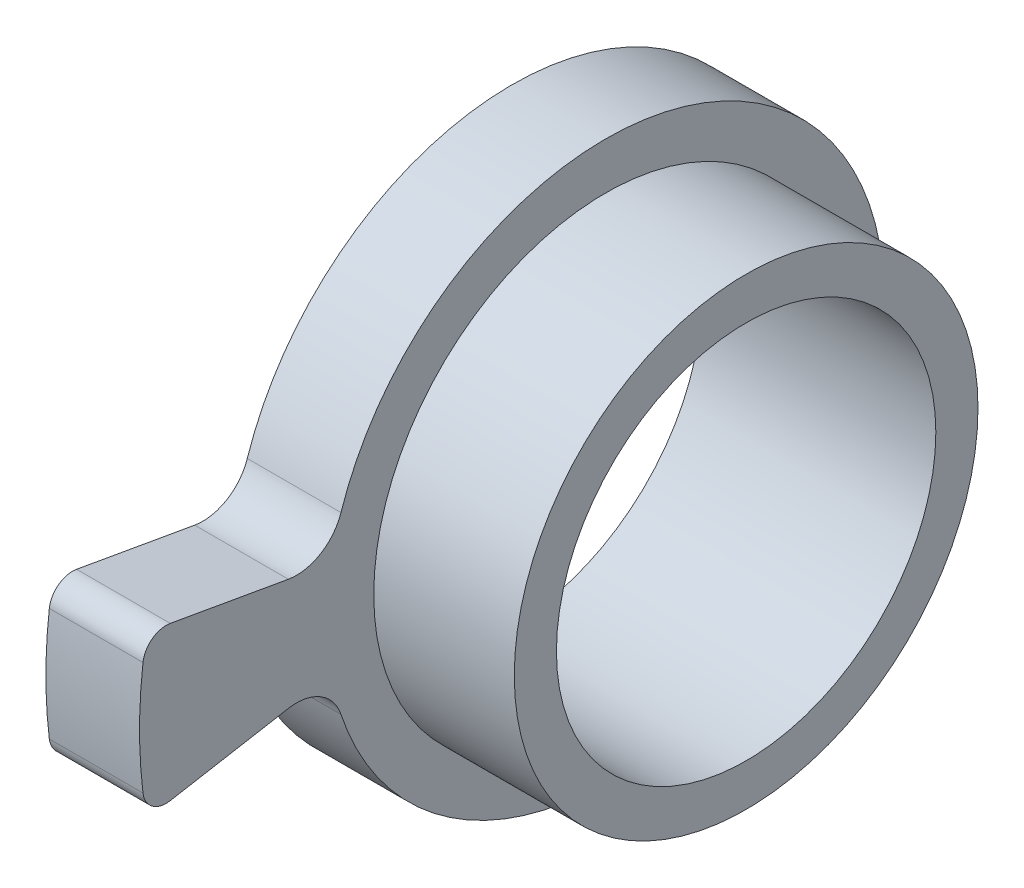
ISO-10303-21;
HEADER;
FILE_DESCRIPTION(('STEP AP214'),'2;1');
FILE_NAME('part.step','',(''),(''),'','','');
FILE_SCHEMA(('AUTOMOTIVE_DESIGN { 1 0 10303 214 1 1 1 1 }'));
ENDSEC;
DATA;
#1=APPLICATION_CONTEXT('core data for automotive mechanical design processes');
#2=APPLICATION_PROTOCOL_DEFINITION('international standard','automotive_design',2000,#1);
#3=PRODUCT_CONTEXT('',#1,'mechanical');
#4=PRODUCT('Part','Part','',(#3));
#5=PRODUCT_RELATED_PRODUCT_CATEGORY('part','',(#4));
#6=PRODUCT_DEFINITION_FORMATION('','',#4);
#7=PRODUCT_DEFINITION_CONTEXT('part definition',#1,'design');
#8=PRODUCT_DEFINITION('design','',#6,#7);
#9=PRODUCT_DEFINITION_SHAPE('','',#8);
#10=(LENGTH_UNIT() NAMED_UNIT(*) SI_UNIT(.MILLI.,.METRE.));
#11=(NAMED_UNIT(*) PLANE_ANGLE_UNIT() SI_UNIT($,.RADIAN.));
#12=(NAMED_UNIT(*) SI_UNIT($,.STERADIAN.) SOLID_ANGLE_UNIT());
#13=UNCERTAINTY_MEASURE_WITH_UNIT(LENGTH_MEASURE(1.E-05),#10,'distance_accuracy_value','');
#14=(GEOMETRIC_REPRESENTATION_CONTEXT(3) GLOBAL_UNCERTAINTY_ASSIGNED_CONTEXT((#13)) GLOBAL_UNIT_ASSIGNED_CONTEXT((#10,
#11,#12)) REPRESENTATION_CONTEXT('',''));
#15=CARTESIAN_POINT('',(0.,0.,0.));
#16=DIRECTION('',(0.,0.,1.));
#17=DIRECTION('',(1.,0.,0.));
#18=AXIS2_PLACEMENT_3D('',#15,#16,#17);
#19=CARTESIAN_POINT('',(-3.99600435518086,0.,0.));
#20=DIRECTION('',(-1.,0.,0.));
#21=DIRECTION('',(0.,0.,1.));
#22=AXIS2_PLACEMENT_3D('',#19,#20,#21);
#23=CYLINDRICAL_SURFACE('',#22,4.05);
#24=CARTESIAN_POINT('',(5.,0.,0.));
#25=DIRECTION('',(-1.,0.,0.));
#26=DIRECTION('',(0.,0.,1.));
#27=AXIS2_PLACEMENT_3D('',#24,#25,#26);
#28=CIRCLE('',#27,4.05);
#29=CARTESIAN_POINT('',(5.,0.,4.05));
#30=VERTEX_POINT('',#29);
#31=EDGE_CURVE('E174',#30,#30,#28,.T.);
#32=ORIENTED_EDGE('',*,*,#31,.F.);
#33=EDGE_LOOP('',(#32));
#34=FACE_BOUND('',#33,.T.);
#35=CARTESIAN_POINT('',(0.,0.,0.));
#36=DIRECTION('',(-1.,0.,0.));
#37=DIRECTION('',(0.,0.,1.));
#38=AXIS2_PLACEMENT_3D('',#35,#36,#37);
#39=CIRCLE('',#38,4.05);
#40=CARTESIAN_POINT('',(0.,0.,4.05));
#41=VERTEX_POINT('',#40);
#42=EDGE_CURVE('E122',#41,#41,#39,.T.);
#43=ORIENTED_EDGE('',*,*,#42,.T.);
#44=EDGE_LOOP('',(#43));
#45=FACE_BOUND('',#44,.T.);
#46=ADVANCED_FACE('F33',(#34,#45),#23,.F.);
#47=CARTESIAN_POINT('',(0.,4.05,0.));
#48=DIRECTION('',(1.,0.,0.));
#49=DIRECTION('',(0.,0.,-1.));
#50=AXIS2_PLACEMENT_3D('',#47,#48,#49);
#51=PLANE('',#50);
#52=ORIENTED_EDGE('',*,*,#42,.F.);
#53=EDGE_LOOP('',(#52));
#54=FACE_BOUND('',#53,.T.);
#55=CARTESIAN_POINT('',(0.,0.,0.));
#56=DIRECTION('',(-1.,0.,0.));
#57=DIRECTION('',(0.,0.,1.));
#58=AXIS2_PLACEMENT_3D('',#55,#56,#57);
#59=CIRCLE('',#58,9.95);
#60=CARTESIAN_POINT('',(0.,-1.20692221669696,9.87652969229796));
#61=VERTEX_POINT('',#60);
#62=CARTESIAN_POINT('',(0.,1.20692221669696,9.87652969229796));
#63=VERTEX_POINT('',#62);
#64=EDGE_CURVE('E165',#61,#63,#59,.T.);
#65=ORIENTED_EDGE('',*,*,#64,.T.);
#66=CARTESIAN_POINT('',(0.,1.146272859074,9.38022166755937));
#67=DIRECTION('',(1.,0.,0.));
#68=DIRECTION('',(0.,0.,-1.));
#69=AXIS2_PLACEMENT_3D('',#66,#67,#68);
#70=CIRCLE('',#69,0.5);
#71=CARTESIAN_POINT('',(0.,1.6386767355801,9.29339757872591));
#72=VERTEX_POINT('',#71);
#73=EDGE_CURVE('E148',#63,#72,#70,.F.);
#74=ORIENTED_EDGE('',*,*,#73,.T.);
#75=DIRECTION('',(0.,-0.173648177666931,-0.984807753012208));
#76=VECTOR('',#75,1.);
#77=CARTESIAN_POINT('',(0.,1.03320665711824,5.85960613042264));
#78=LINE('',#77,#76);
#79=CARTESIAN_POINT('',(0.,1.19429682350632,6.77319386237857));
#80=VERTEX_POINT('',#79);
#81=EDGE_CURVE('E106',#72,#80,#78,.T.);
#82=ORIENTED_EDGE('',*,*,#81,.T.);
#83=CARTESIAN_POINT('',(0.,2.17910457651853,6.59954568471164));
#84=DIRECTION('',(1.,0.,0.));
#85=DIRECTION('',(0.,0.,-1.));
#86=AXIS2_PLACEMENT_3D('',#83,#84,#85);
#87=CIRCLE('',#86,1.);
#88=CARTESIAN_POINT('',(0.,1.86556434968133,5.64997076604809));
#89=VERTEX_POINT('',#88);
#90=EDGE_CURVE('E101',#80,#89,#87,.T.);
#91=ORIENTED_EDGE('',*,*,#90,.T.);
#92=CARTESIAN_POINT('',(0.,0.,0.));
#93=DIRECTION('',(-1.,0.,0.));
#94=DIRECTION('',(0.,0.,1.));
#95=AXIS2_PLACEMENT_3D('',#92,#93,#94);
#96=CIRCLE('',#95,5.95);
#97=CARTESIAN_POINT('',(0.,-1.86556434968133,5.64997076604809));
#98=VERTEX_POINT('',#97);
#99=EDGE_CURVE('E105',#89,#98,#96,.T.);
#100=ORIENTED_EDGE('',*,*,#99,.T.);
#101=CARTESIAN_POINT('',(0.,-2.17910457651853,6.59954568471164));
#102=DIRECTION('',(1.,0.,0.));
#103=DIRECTION('',(0.,0.,-1.));
#104=AXIS2_PLACEMENT_3D('',#101,#102,#103);
#105=CIRCLE('',#104,1.);
#106=CARTESIAN_POINT('',(0.,-1.19429682350632,6.77319386237857));
#107=VERTEX_POINT('',#106);
#108=EDGE_CURVE('E137',#98,#107,#105,.T.);
#109=ORIENTED_EDGE('',*,*,#108,.T.);
#110=DIRECTION('',(0.,-0.173648177666931,0.984807753012208));
#111=VECTOR('',#110,1.);
#112=CARTESIAN_POINT('',(0.,-1.03320665711824,5.85960613042264));
#113=LINE('',#112,#111);
#114=CARTESIAN_POINT('',(0.,-1.6386767355801,9.29339757872591));
#115=VERTEX_POINT('',#114);
#116=EDGE_CURVE('E168',#107,#115,#113,.T.);
#117=ORIENTED_EDGE('',*,*,#116,.T.);
#118=CARTESIAN_POINT('',(0.,-1.146272859074,9.38022166755937));
#119=DIRECTION('',(1.,0.,0.));
#120=DIRECTION('',(0.,0.,-1.));
#121=AXIS2_PLACEMENT_3D('',#118,#119,#120);
#122=CIRCLE('',#121,0.5);
#123=EDGE_CURVE('E146',#115,#61,#122,.F.);
#124=ORIENTED_EDGE('',*,*,#123,.T.);
#125=EDGE_LOOP('',(#65,#74,#82,#91,#100,#109,#117,#124));
#126=FACE_BOUND('',#125,.T.);
#127=ADVANCED_FACE('F104',(#54,#126),#51,.F.);
#128=CARTESIAN_POINT('',(-3.99600435518086,0.,0.));
#129=DIRECTION('',(-1.,0.,0.));
#130=DIRECTION('',(0.,0.,1.));
#131=AXIS2_PLACEMENT_3D('',#128,#129,#130);
#132=CYLINDRICAL_SURFACE('',#131,5.95);
#133=CARTESIAN_POINT('',(2.,0.,0.));
#134=DIRECTION('',(-1.,0.,0.));
#135=DIRECTION('',(0.,0.,1.));
#136=AXIS2_PLACEMENT_3D('',#133,#134,#135);
#137=CIRCLE('',#136,5.95);
#138=CARTESIAN_POINT('',(2.,1.86556434968133,5.64997076604809));
#139=VERTEX_POINT('',#138);
#140=CARTESIAN_POINT('',(2.,-1.86556434968133,5.64997076604809));
#141=VERTEX_POINT('',#140);
#142=EDGE_CURVE('E123',#139,#141,#137,.T.);
#143=ORIENTED_EDGE('',*,*,#142,.T.);
#144=DIRECTION('',(-1.,0.,0.));
#145=VECTOR('',#144,1.);
#146=CARTESIAN_POINT('',(-3.99600435518086,-1.86556434968133,5.64997076604809));
#147=LINE('',#146,#145);
#148=EDGE_CURVE('E121',#141,#98,#147,.T.);
#149=ORIENTED_EDGE('',*,*,#148,.T.);
#150=ORIENTED_EDGE('',*,*,#99,.F.);
#151=DIRECTION('',(-1.,0.,0.));
#152=VECTOR('',#151,1.);
#153=CARTESIAN_POINT('',(-3.99600435518086,1.86556434968133,5.64997076604809));
#154=LINE('',#153,#152);
#155=EDGE_CURVE('E118',#89,#139,#154,.F.);
#156=ORIENTED_EDGE('',*,*,#155,.T.);
#157=EDGE_LOOP('',(#143,#149,#150,#156));
#158=FACE_BOUND('',#157,.T.);
#159=ADVANCED_FACE('F117',(#158),#132,.T.);
#160=CARTESIAN_POINT('',(2.,5.95,0.));
#161=DIRECTION('',(-1.,0.,0.));
#162=DIRECTION('',(0.,0.,1.));
#163=AXIS2_PLACEMENT_3D('',#160,#161,#162);
#164=PLANE('',#163);
#165=DIRECTION('',(0.,0.173648177666931,0.984807753012208));
#166=VECTOR('',#165,1.);
#167=CARTESIAN_POINT('',(2.,1.03320665711824,5.85960613042264));
#168=LINE('',#167,#166);
#169=CARTESIAN_POINT('',(2.,1.19429682350632,6.77319386237857));
#170=VERTEX_POINT('',#169);
#171=CARTESIAN_POINT('',(2.,1.6386767355801,9.29339757872591));
#172=VERTEX_POINT('',#171);
#173=EDGE_CURVE('E156',#170,#172,#168,.T.);
#174=ORIENTED_EDGE('',*,*,#173,.T.);
#175=CARTESIAN_POINT('',(2.,1.146272859074,9.38022166755937));
#176=DIRECTION('',(-1.,0.,0.));
#177=DIRECTION('',(0.,0.,1.));
#178=AXIS2_PLACEMENT_3D('',#175,#176,#177);
#179=CIRCLE('',#178,0.5);
#180=CARTESIAN_POINT('',(2.,1.20692221669696,9.87652969229796));
#181=VERTEX_POINT('',#180);
#182=EDGE_CURVE('E41',#172,#181,#179,.F.);
#183=ORIENTED_EDGE('',*,*,#182,.T.);
#184=CARTESIAN_POINT('',(2.,0.,0.));
#185=DIRECTION('',(-1.,0.,0.));
#186=DIRECTION('',(0.,0.,1.));
#187=AXIS2_PLACEMENT_3D('',#184,#185,#186);
#188=CIRCLE('',#187,9.95);
#189=CARTESIAN_POINT('',(2.,-1.20692221669696,9.87652969229796));
#190=VERTEX_POINT('',#189);
#191=EDGE_CURVE('E155',#181,#190,#188,.F.);
#192=ORIENTED_EDGE('',*,*,#191,.T.);
#193=CARTESIAN_POINT('',(2.,-1.146272859074,9.38022166755937));
#194=DIRECTION('',(-1.,0.,0.));
#195=DIRECTION('',(0.,0.,1.));
#196=AXIS2_PLACEMENT_3D('',#193,#194,#195);
#197=CIRCLE('',#196,0.5);
#198=CARTESIAN_POINT('',(2.,-1.6386767355801,9.29339757872591));
#199=VERTEX_POINT('',#198);
#200=EDGE_CURVE('E48',#190,#199,#197,.F.);
#201=ORIENTED_EDGE('',*,*,#200,.T.);
#202=DIRECTION('',(0.,0.173648177666931,-0.984807753012208));
#203=VECTOR('',#202,1.);
#204=CARTESIAN_POINT('',(2.,-1.03320665711824,5.85960613042264));
#205=LINE('',#204,#203);
#206=CARTESIAN_POINT('',(2.,-1.19429682350632,6.77319386237857));
#207=VERTEX_POINT('',#206);
#208=EDGE_CURVE('E172',#199,#207,#205,.T.);
#209=ORIENTED_EDGE('',*,*,#208,.T.);
#210=CARTESIAN_POINT('',(2.,-2.17910457651853,6.59954568471164));
#211=DIRECTION('',(-1.,0.,0.));
#212=DIRECTION('',(0.,0.,1.));
#213=AXIS2_PLACEMENT_3D('',#210,#211,#212);
#214=CIRCLE('',#213,1.);
#215=EDGE_CURVE('E112',#207,#141,#214,.T.);
#216=ORIENTED_EDGE('',*,*,#215,.T.);
#217=ORIENTED_EDGE('',*,*,#142,.F.);
#218=CARTESIAN_POINT('',(2.,2.17910457651853,6.59954568471164));
#219=DIRECTION('',(-1.,0.,0.));
#220=DIRECTION('',(0.,0.,1.));
#221=AXIS2_PLACEMENT_3D('',#218,#219,#220);
#222=CIRCLE('',#221,1.);
#223=EDGE_CURVE('E111',#139,#170,#222,.T.);
#224=ORIENTED_EDGE('',*,*,#223,.T.);
#225=EDGE_LOOP('',(#174,#183,#192,#201,#209,#216,#217,#224));
#226=FACE_BOUND('',#225,.T.);
#227=CARTESIAN_POINT('',(2.,0.,0.));
#228=DIRECTION('',(-1.,0.,0.));
#229=DIRECTION('',(0.,0.,1.));
#230=AXIS2_PLACEMENT_3D('',#227,#228,#229);
#231=CIRCLE('',#230,4.95);
#232=CARTESIAN_POINT('',(2.,0.,4.95));
#233=VERTEX_POINT('',#232);
#234=EDGE_CURVE('E180',#233,#233,#231,.T.);
#235=ORIENTED_EDGE('',*,*,#234,.T.);
#236=EDGE_LOOP('',(#235));
#237=FACE_BOUND('',#236,.T.);
#238=ADVANCED_FACE('F153',(#226,#237),#164,.F.);
#239=CARTESIAN_POINT('',(-3.99600435518086,0.,0.));
#240=DIRECTION('',(-1.,0.,0.));
#241=DIRECTION('',(0.,0.,1.));
#242=AXIS2_PLACEMENT_3D('',#239,#240,#241);
#243=CYLINDRICAL_SURFACE('',#242,4.95);
#244=ORIENTED_EDGE('',*,*,#234,.F.);
#245=EDGE_LOOP('',(#244));
#246=FACE_BOUND('',#245,.T.);
#247=CARTESIAN_POINT('',(5.,0.,0.));
#248=DIRECTION('',(-1.,0.,0.));
#249=DIRECTION('',(0.,0.,1.));
#250=AXIS2_PLACEMENT_3D('',#247,#248,#249);
#251=CIRCLE('',#250,4.95);
#252=CARTESIAN_POINT('',(5.,0.,4.95));
#253=VERTEX_POINT('',#252);
#254=EDGE_CURVE('E177',#253,#253,#251,.T.);
#255=ORIENTED_EDGE('',*,*,#254,.T.);
#256=EDGE_LOOP('',(#255));
#257=FACE_BOUND('',#256,.T.);
#258=ADVANCED_FACE('F252',(#246,#257),#243,.T.);
#259=CARTESIAN_POINT('',(5.,4.95,0.));
#260=DIRECTION('',(-1.,0.,0.));
#261=DIRECTION('',(0.,0.,1.));
#262=AXIS2_PLACEMENT_3D('',#259,#260,#261);
#263=PLANE('',#262);
#264=ORIENTED_EDGE('',*,*,#254,.F.);
#265=EDGE_LOOP('',(#264));
#266=FACE_BOUND('',#265,.T.);
#267=ORIENTED_EDGE('',*,*,#31,.T.);
#268=EDGE_LOOP('',(#267));
#269=FACE_BOUND('',#268,.T.);
#270=ADVANCED_FACE('F246',(#266,#269),#263,.F.);
#271=CARTESIAN_POINT('',(7.35466942299544,1.03320665711824,5.85960613042264));
#272=DIRECTION('',(0.,0.984807753012208,-0.173648177666931));
#273=DIRECTION('',(0.,0.173648177666931,0.984807753012208));
#274=AXIS2_PLACEMENT_3D('',#271,#272,#273);
#275=PLANE('',#274);
#276=ORIENTED_EDGE('',*,*,#81,.F.);
#277=DIRECTION('',(-1.,0.,0.));
#278=VECTOR('',#277,1.);
#279=CARTESIAN_POINT('',(7.35466942299544,1.6386767355801,9.29339757872591));
#280=LINE('',#279,#278);
#281=EDGE_CURVE('E56',#72,#172,#280,.F.);
#282=ORIENTED_EDGE('',*,*,#281,.T.);
#283=ORIENTED_EDGE('',*,*,#173,.F.);
#284=DIRECTION('',(-1.,0.,0.));
#285=VECTOR('',#284,1.);
#286=CARTESIAN_POINT('',(7.35466942299544,1.19429682350632,6.77319386237857));
#287=LINE('',#286,#285);
#288=EDGE_CURVE('E135',#170,#80,#287,.T.);
#289=ORIENTED_EDGE('',*,*,#288,.T.);
#290=EDGE_LOOP('',(#276,#282,#283,#289));
#291=FACE_BOUND('',#290,.T.);
#292=ADVANCED_FACE('F166',(#291),#275,.T.);
#293=CARTESIAN_POINT('',(7.35466942299544,0.,0.));
#294=DIRECTION('',(-1.,0.,0.));
#295=DIRECTION('',(0.,0.,1.));
#296=AXIS2_PLACEMENT_3D('',#293,#294,#295);
#297=CYLINDRICAL_SURFACE('',#296,9.95);
#298=ORIENTED_EDGE('',*,*,#191,.F.);
#299=DIRECTION('',(-1.,0.,0.));
#300=VECTOR('',#299,1.);
#301=CARTESIAN_POINT('',(7.35466942299544,1.20692221669696,9.87652969229796));
#302=LINE('',#301,#300);
#303=EDGE_CURVE('E143',#181,#63,#302,.T.);
#304=ORIENTED_EDGE('',*,*,#303,.T.);
#305=ORIENTED_EDGE('',*,*,#64,.F.);
#306=DIRECTION('',(-1.,0.,0.));
#307=VECTOR('',#306,1.);
#308=CARTESIAN_POINT('',(7.35466942299544,-1.20692221669696,9.87652969229796));
#309=LINE('',#308,#307);
#310=EDGE_CURVE('E141',#61,#190,#309,.F.);
#311=ORIENTED_EDGE('',*,*,#310,.T.);
#312=EDGE_LOOP('',(#298,#304,#305,#311));
#313=FACE_BOUND('',#312,.T.);
#314=ADVANCED_FACE('F160',(#313),#297,.T.);
#315=CARTESIAN_POINT('',(7.35466942299544,-1.03320665711824,5.85960613042264));
#316=DIRECTION('',(0.,-0.984807753012208,-0.173648177666931));
#317=DIRECTION('',(0.,0.173648177666931,-0.984807753012208));
#318=AXIS2_PLACEMENT_3D('',#315,#316,#317);
#319=PLANE('',#318);
#320=ORIENTED_EDGE('',*,*,#208,.F.);
#321=DIRECTION('',(-1.,0.,0.));
#322=VECTOR('',#321,1.);
#323=CARTESIAN_POINT('',(7.35466942299544,-1.6386767355801,9.29339757872591));
#324=LINE('',#323,#322);
#325=EDGE_CURVE('E11',#199,#115,#324,.T.);
#326=ORIENTED_EDGE('',*,*,#325,.T.);
#327=ORIENTED_EDGE('',*,*,#116,.F.);
#328=DIRECTION('',(-1.,0.,0.));
#329=VECTOR('',#328,1.);
#330=CARTESIAN_POINT('',(7.35466942299544,-1.19429682350632,6.77319386237857));
#331=LINE('',#330,#329);
#332=EDGE_CURVE('E128',#107,#207,#331,.F.);
#333=ORIENTED_EDGE('',*,*,#332,.T.);
#334=EDGE_LOOP('',(#320,#326,#327,#333));
#335=FACE_BOUND('',#334,.T.);
#336=ADVANCED_FACE('F190',(#335),#319,.T.);
#337=CARTESIAN_POINT('',(-3.99600435518086,-2.17910457651853,6.59954568471164));
#338=DIRECTION('',(-1.,0.,0.));
#339=DIRECTION('',(0.,0.,1.));
#340=AXIS2_PLACEMENT_3D('',#337,#338,#339);
#341=CYLINDRICAL_SURFACE('',#340,1.);
#342=ORIENTED_EDGE('',*,*,#215,.F.);
#343=ORIENTED_EDGE('',*,*,#332,.F.);
#344=ORIENTED_EDGE('',*,*,#108,.F.);
#345=ORIENTED_EDGE('',*,*,#148,.F.);
#346=EDGE_LOOP('',(#342,#343,#344,#345));
#347=FACE_BOUND('',#346,.T.);
#348=ADVANCED_FACE('F185',(#347),#341,.F.);
#349=CARTESIAN_POINT('',(-3.99600435518086,2.17910457651853,6.59954568471164));
#350=DIRECTION('',(-1.,0.,0.));
#351=DIRECTION('',(0.,0.,1.));
#352=AXIS2_PLACEMENT_3D('',#349,#350,#351);
#353=CYLINDRICAL_SURFACE('',#352,1.);
#354=ORIENTED_EDGE('',*,*,#223,.F.);
#355=ORIENTED_EDGE('',*,*,#155,.F.);
#356=ORIENTED_EDGE('',*,*,#90,.F.);
#357=ORIENTED_EDGE('',*,*,#288,.F.);
#358=EDGE_LOOP('',(#354,#355,#356,#357));
#359=FACE_BOUND('',#358,.T.);
#360=ADVANCED_FACE('F126',(#359),#353,.F.);
#361=CARTESIAN_POINT('',(7.35466942299544,1.146272859074,9.38022166755937));
#362=DIRECTION('',(-1.,0.,0.));
#363=DIRECTION('',(0.,0.,1.));
#364=AXIS2_PLACEMENT_3D('',#361,#362,#363);
#365=CYLINDRICAL_SURFACE('',#364,0.5);
#366=ORIENTED_EDGE('',*,*,#182,.F.);
#367=ORIENTED_EDGE('',*,*,#281,.F.);
#368=ORIENTED_EDGE('',*,*,#73,.F.);
#369=ORIENTED_EDGE('',*,*,#303,.F.);
#370=EDGE_LOOP('',(#366,#367,#368,#369));
#371=FACE_BOUND('',#370,.T.);
#372=ADVANCED_FACE('F164',(#371),#365,.T.);
#373=CARTESIAN_POINT('',(7.35466942299544,-1.146272859074,9.38022166755937));
#374=DIRECTION('',(-1.,0.,0.));
#375=DIRECTION('',(0.,0.,1.));
#376=AXIS2_PLACEMENT_3D('',#373,#374,#375);
#377=CYLINDRICAL_SURFACE('',#376,0.5);
#378=ORIENTED_EDGE('',*,*,#200,.F.);
#379=ORIENTED_EDGE('',*,*,#310,.F.);
#380=ORIENTED_EDGE('',*,*,#123,.F.);
#381=ORIENTED_EDGE('',*,*,#325,.F.);
#382=EDGE_LOOP('',(#378,#379,#380,#381));
#383=FACE_BOUND('',#382,.T.);
#384=ADVANCED_FACE('F35',(#383),#377,.T.);
#385=CLOSED_SHELL('',(#46,#127,#159,#238,#258,#270,#292,#314,#336,#348,#360,#372,#384));
#386=MANIFOLD_SOLID_BREP('B2',#385);
#387=ADVANCED_BREP_SHAPE_REPRESENTATION('',(#18,#386),#14);
#388=SHAPE_DEFINITION_REPRESENTATION(#9,#387);
ENDSEC;
END-ISO-10303-21;
